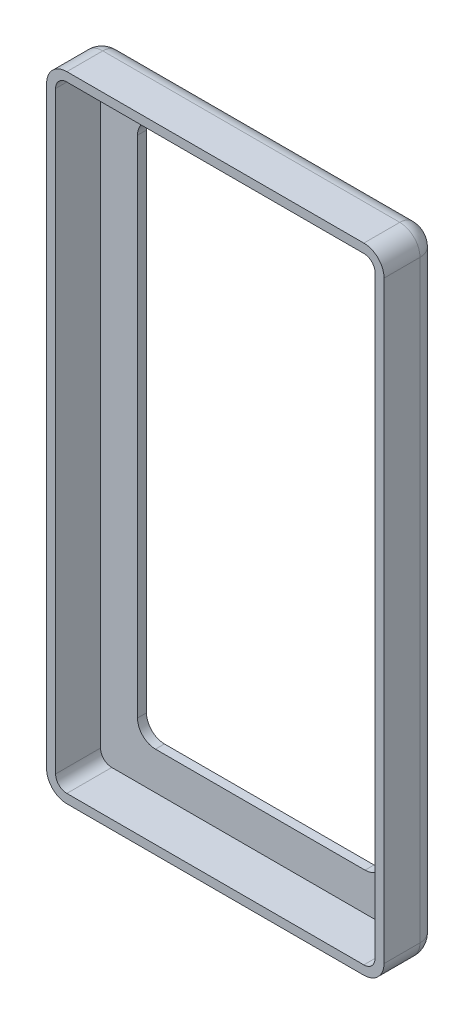
ISO-10303-21;
HEADER;
FILE_DESCRIPTION(('STEP AP214'),'2;1');
FILE_NAME('part.step','',(''),(''),'','','');
FILE_SCHEMA(('AUTOMOTIVE_DESIGN { 1 0 10303 214 1 1 1 1 }'));
ENDSEC;
DATA;
#1=APPLICATION_CONTEXT('core data for automotive mechanical design processes');
#2=APPLICATION_PROTOCOL_DEFINITION('international standard','automotive_design',2000,#1);
#3=PRODUCT_CONTEXT('',#1,'mechanical');
#4=PRODUCT('Part','Part','',(#3));
#5=PRODUCT_RELATED_PRODUCT_CATEGORY('part','',(#4));
#6=PRODUCT_DEFINITION_FORMATION('','',#4);
#7=PRODUCT_DEFINITION_CONTEXT('part definition',#1,'design');
#8=PRODUCT_DEFINITION('design','',#6,#7);
#9=PRODUCT_DEFINITION_SHAPE('','',#8);
#10=(LENGTH_UNIT() NAMED_UNIT(*) SI_UNIT(.MILLI.,.METRE.));
#11=(NAMED_UNIT(*) PLANE_ANGLE_UNIT() SI_UNIT($,.RADIAN.));
#12=(NAMED_UNIT(*) SI_UNIT($,.STERADIAN.) SOLID_ANGLE_UNIT());
#13=UNCERTAINTY_MEASURE_WITH_UNIT(LENGTH_MEASURE(1.E-05),#10,'distance_accuracy_value','');
#14=(GEOMETRIC_REPRESENTATION_CONTEXT(3) GLOBAL_UNCERTAINTY_ASSIGNED_CONTEXT((#13)) GLOBAL_UNIT_ASSIGNED_CONTEXT((#10,
#11,#12)) REPRESENTATION_CONTEXT('',''));
#15=CARTESIAN_POINT('',(0.,0.,0.));
#16=DIRECTION('',(0.,0.,1.));
#17=DIRECTION('',(1.,0.,0.));
#18=AXIS2_PLACEMENT_3D('',#15,#16,#17);
#19=CARTESIAN_POINT('',(32.5737767757912,-65.098576794141,10.));
#20=DIRECTION('',(0.,0.,-1.));
#21=DIRECTION('',(-1.,0.,0.));
#22=AXIS2_PLACEMENT_3D('',#19,#20,#21);
#23=CYLINDRICAL_SURFACE('',#22,4.5);
#24=DIRECTION('',(0.,0.,-1.));
#25=VECTOR('',#24,1.);
#26=CARTESIAN_POINT('',(32.5737767757912,-69.598576794141,10.));
#27=LINE('',#26,#25);
#28=CARTESIAN_POINT('',(32.5737767757912,-69.598576794141,10.));
#29=VERTEX_POINT('',#28);
#30=CARTESIAN_POINT('',(32.5737767757912,-69.598576794141,2.));
#31=VERTEX_POINT('',#30);
#32=EDGE_CURVE('E333',#29,#31,#27,.T.);
#33=ORIENTED_EDGE('',*,*,#32,.T.);
#34=CARTESIAN_POINT('',(32.5737767757912,-65.098576794141,2.));
#35=DIRECTION('',(0.,0.,1.));
#36=DIRECTION('',(1.,0.,0.));
#37=AXIS2_PLACEMENT_3D('',#34,#35,#36);
#38=CIRCLE('',#37,4.5);
#39=CARTESIAN_POINT('',(37.0737767757912,-65.098576794141,2.));
#40=VERTEX_POINT('',#39);
#41=EDGE_CURVE('E388',#31,#40,#38,.T.);
#42=ORIENTED_EDGE('',*,*,#41,.T.);
#43=DIRECTION('',(0.,0.,1.));
#44=VECTOR('',#43,1.);
#45=CARTESIAN_POINT('',(37.0737767757912,-65.098576794141,10.));
#46=LINE('',#45,#44);
#47=CARTESIAN_POINT('',(37.0737767757912,-65.098576794141,10.));
#48=VERTEX_POINT('',#47);
#49=EDGE_CURVE('E328',#48,#40,#46,.F.);
#50=ORIENTED_EDGE('',*,*,#49,.F.);
#51=CARTESIAN_POINT('',(32.5737767757912,-65.098576794141,10.));
#52=DIRECTION('',(0.,0.,1.));
#53=DIRECTION('',(1.,0.,0.));
#54=AXIS2_PLACEMENT_3D('',#51,#52,#53);
#55=CIRCLE('',#54,4.5);
#56=EDGE_CURVE('E327',#29,#48,#55,.T.);
#57=ORIENTED_EDGE('',*,*,#56,.F.);
#58=EDGE_LOOP('',(#33,#42,#50,#57));
#59=FACE_BOUND('',#58,.T.);
#60=ADVANCED_FACE('F34',(#59),#23,.T.);
#61=CARTESIAN_POINT('',(37.0737767757912,-65.098576794141,10.));
#62=DIRECTION('',(-1.,0.,0.));
#63=DIRECTION('',(0.,0.,1.));
#64=AXIS2_PLACEMENT_3D('',#61,#62,#63);
#65=PLANE('',#64);
#66=ORIENTED_EDGE('',*,*,#49,.T.);
#67=DIRECTION('',(0.,1.,0.));
#68=VECTOR('',#67,1.);
#69=CARTESIAN_POINT('',(37.0737767757912,-65.098576794141,2.));
#70=LINE('',#69,#68);
#71=CARTESIAN_POINT('',(37.0737767757912,67.061423205859,2.));
#72=VERTEX_POINT('',#71);
#73=EDGE_CURVE('E331',#40,#72,#70,.T.);
#74=ORIENTED_EDGE('',*,*,#73,.T.);
#75=DIRECTION('',(0.,0.,-1.));
#76=VECTOR('',#75,1.);
#77=CARTESIAN_POINT('',(37.0737767757912,67.061423205859,10.));
#78=LINE('',#77,#76);
#79=CARTESIAN_POINT('',(37.0737767757912,67.061423205859,10.));
#80=VERTEX_POINT('',#79);
#81=EDGE_CURVE('E332',#80,#72,#78,.T.);
#82=ORIENTED_EDGE('',*,*,#81,.F.);
#83=DIRECTION('',(0.,1.,0.));
#84=VECTOR('',#83,1.);
#85=CARTESIAN_POINT('',(37.0737767757912,-65.098576794141,10.));
#86=LINE('',#85,#84);
#87=EDGE_CURVE('E356',#48,#80,#86,.T.);
#88=ORIENTED_EDGE('',*,*,#87,.F.);
#89=EDGE_LOOP('',(#66,#74,#82,#88));
#90=FACE_BOUND('',#89,.T.);
#91=ADVANCED_FACE('F474',(#90),#65,.F.);
#92=CARTESIAN_POINT('',(32.5737767757912,67.061423205859,10.));
#93=DIRECTION('',(0.,0.,-1.));
#94=DIRECTION('',(-1.,0.,0.));
#95=AXIS2_PLACEMENT_3D('',#92,#93,#94);
#96=CYLINDRICAL_SURFACE('',#95,4.5);
#97=ORIENTED_EDGE('',*,*,#81,.T.);
#98=CARTESIAN_POINT('',(32.5737767757912,67.061423205859,2.));
#99=DIRECTION('',(0.,0.,1.));
#100=DIRECTION('',(1.,0.,0.));
#101=AXIS2_PLACEMENT_3D('',#98,#99,#100);
#102=CIRCLE('',#101,4.5);
#103=CARTESIAN_POINT('',(32.5737767757912,71.561423205859,2.));
#104=VERTEX_POINT('',#103);
#105=EDGE_CURVE('E400',#72,#104,#102,.T.);
#106=ORIENTED_EDGE('',*,*,#105,.T.);
#107=DIRECTION('',(0.,0.,-1.));
#108=VECTOR('',#107,1.);
#109=CARTESIAN_POINT('',(32.5737767757912,71.561423205859,10.));
#110=LINE('',#109,#108);
#111=CARTESIAN_POINT('',(32.5737767757912,71.561423205859,10.));
#112=VERTEX_POINT('',#111);
#113=EDGE_CURVE('E340',#112,#104,#110,.T.);
#114=ORIENTED_EDGE('',*,*,#113,.F.);
#115=CARTESIAN_POINT('',(32.5737767757912,67.061423205859,10.));
#116=DIRECTION('',(0.,0.,1.));
#117=DIRECTION('',(1.,0.,0.));
#118=AXIS2_PLACEMENT_3D('',#115,#116,#117);
#119=CIRCLE('',#118,4.5);
#120=EDGE_CURVE('E358',#80,#112,#119,.T.);
#121=ORIENTED_EDGE('',*,*,#120,.F.);
#122=EDGE_LOOP('',(#97,#106,#114,#121));
#123=FACE_BOUND('',#122,.T.);
#124=ADVANCED_FACE('F480',(#123),#96,.T.);
#125=CARTESIAN_POINT('',(-33.5462232242087,71.561423205859,10.));
#126=DIRECTION('',(0.,-1.,0.));
#127=DIRECTION('',(0.,0.,-1.));
#128=AXIS2_PLACEMENT_3D('',#125,#126,#127);
#129=PLANE('',#128);
#130=ORIENTED_EDGE('',*,*,#113,.T.);
#131=DIRECTION('',(-1.,0.,0.));
#132=VECTOR('',#131,1.);
#133=CARTESIAN_POINT('',(-33.5462232242087,71.561423205859,2.));
#134=LINE('',#133,#132);
#135=CARTESIAN_POINT('',(-33.5462232242087,71.561423205859,2.));
#136=VERTEX_POINT('',#135);
#137=EDGE_CURVE('E398',#104,#136,#134,.T.);
#138=ORIENTED_EDGE('',*,*,#137,.T.);
#139=DIRECTION('',(0.,0.,-1.));
#140=VECTOR('',#139,1.);
#141=CARTESIAN_POINT('',(-33.5462232242087,71.561423205859,10.));
#142=LINE('',#141,#140);
#143=CARTESIAN_POINT('',(-33.5462232242087,71.561423205859,10.));
#144=VERTEX_POINT('',#143);
#145=EDGE_CURVE('E343',#144,#136,#142,.T.);
#146=ORIENTED_EDGE('',*,*,#145,.F.);
#147=DIRECTION('',(-1.,0.,0.));
#148=VECTOR('',#147,1.);
#149=CARTESIAN_POINT('',(-33.5462232242087,71.561423205859,10.));
#150=LINE('',#149,#148);
#151=EDGE_CURVE('E360',#112,#144,#150,.T.);
#152=ORIENTED_EDGE('',*,*,#151,.F.);
#153=EDGE_LOOP('',(#130,#138,#146,#152));
#154=FACE_BOUND('',#153,.T.);
#155=ADVANCED_FACE('F489',(#154),#129,.F.);
#156=CARTESIAN_POINT('',(-33.5462232242088,67.061423205859,10.));
#157=DIRECTION('',(0.,0.,-1.));
#158=DIRECTION('',(-1.,0.,0.));
#159=AXIS2_PLACEMENT_3D('',#156,#157,#158);
#160=CYLINDRICAL_SURFACE('',#159,4.5);
#161=ORIENTED_EDGE('',*,*,#145,.T.);
#162=CARTESIAN_POINT('',(-33.5462232242088,67.061423205859,2.));
#163=DIRECTION('',(0.,0.,1.));
#164=DIRECTION('',(1.,0.,0.));
#165=AXIS2_PLACEMENT_3D('',#162,#163,#164);
#166=CIRCLE('',#165,4.5);
#167=CARTESIAN_POINT('',(-38.0462232242088,67.061423205859,2.));
#168=VERTEX_POINT('',#167);
#169=EDGE_CURVE('E396',#136,#168,#166,.T.);
#170=ORIENTED_EDGE('',*,*,#169,.T.);
#171=DIRECTION('',(0.,0.,-1.));
#172=VECTOR('',#171,1.);
#173=CARTESIAN_POINT('',(-38.0462232242088,67.061423205859,10.));
#174=LINE('',#173,#172);
#175=CARTESIAN_POINT('',(-38.0462232242088,67.061423205859,10.));
#176=VERTEX_POINT('',#175);
#177=EDGE_CURVE('E346',#176,#168,#174,.T.);
#178=ORIENTED_EDGE('',*,*,#177,.F.);
#179=CARTESIAN_POINT('',(-33.5462232242088,67.061423205859,10.));
#180=DIRECTION('',(0.,0.,1.));
#181=DIRECTION('',(1.,0.,0.));
#182=AXIS2_PLACEMENT_3D('',#179,#180,#181);
#183=CIRCLE('',#182,4.5);
#184=EDGE_CURVE('E362',#144,#176,#183,.T.);
#185=ORIENTED_EDGE('',*,*,#184,.F.);
#186=EDGE_LOOP('',(#161,#170,#178,#185));
#187=FACE_BOUND('',#186,.T.);
#188=ADVANCED_FACE('F493',(#187),#160,.T.);
#189=CARTESIAN_POINT('',(-38.0462232242088,-65.098576794141,10.));
#190=DIRECTION('',(1.,0.,0.));
#191=DIRECTION('',(0.,0.,-1.));
#192=AXIS2_PLACEMENT_3D('',#189,#190,#191);
#193=PLANE('',#192);
#194=ORIENTED_EDGE('',*,*,#177,.T.);
#195=DIRECTION('',(0.,-1.,0.));
#196=VECTOR('',#195,1.);
#197=CARTESIAN_POINT('',(-38.0462232242088,-65.098576794141,2.));
#198=LINE('',#197,#196);
#199=CARTESIAN_POINT('',(-38.0462232242088,-65.098576794141,2.));
#200=VERTEX_POINT('',#199);
#201=EDGE_CURVE('E394',#168,#200,#198,.T.);
#202=ORIENTED_EDGE('',*,*,#201,.T.);
#203=DIRECTION('',(0.,0.,-1.));
#204=VECTOR('',#203,1.);
#205=CARTESIAN_POINT('',(-38.0462232242088,-65.098576794141,10.));
#206=LINE('',#205,#204);
#207=CARTESIAN_POINT('',(-38.0462232242088,-65.098576794141,10.));
#208=VERTEX_POINT('',#207);
#209=EDGE_CURVE('E349',#208,#200,#206,.T.);
#210=ORIENTED_EDGE('',*,*,#209,.F.);
#211=DIRECTION('',(0.,-1.,0.));
#212=VECTOR('',#211,1.);
#213=CARTESIAN_POINT('',(-38.0462232242088,-65.098576794141,10.));
#214=LINE('',#213,#212);
#215=EDGE_CURVE('E364',#176,#208,#214,.T.);
#216=ORIENTED_EDGE('',*,*,#215,.F.);
#217=EDGE_LOOP('',(#194,#202,#210,#216));
#218=FACE_BOUND('',#217,.T.);
#219=ADVANCED_FACE('F497',(#218),#193,.F.);
#220=CARTESIAN_POINT('',(-33.5462232242088,-65.098576794141,10.));
#221=DIRECTION('',(0.,0.,-1.));
#222=DIRECTION('',(-1.,0.,0.));
#223=AXIS2_PLACEMENT_3D('',#220,#221,#222);
#224=CYLINDRICAL_SURFACE('',#223,4.5);
#225=ORIENTED_EDGE('',*,*,#209,.T.);
#226=CARTESIAN_POINT('',(-33.5462232242088,-65.098576794141,2.));
#227=DIRECTION('',(0.,0.,1.));
#228=DIRECTION('',(1.,0.,0.));
#229=AXIS2_PLACEMENT_3D('',#226,#227,#228);
#230=CIRCLE('',#229,4.5);
#231=CARTESIAN_POINT('',(-33.5462232242087,-69.598576794141,2.));
#232=VERTEX_POINT('',#231);
#233=EDGE_CURVE('E392',#200,#232,#230,.T.);
#234=ORIENTED_EDGE('',*,*,#233,.T.);
#235=DIRECTION('',(0.,0.,1.));
#236=VECTOR('',#235,1.);
#237=CARTESIAN_POINT('',(-33.5462232242087,-69.598576794141,10.));
#238=LINE('',#237,#236);
#239=CARTESIAN_POINT('',(-33.5462232242087,-69.598576794141,10.));
#240=VERTEX_POINT('',#239);
#241=EDGE_CURVE('E336',#240,#232,#238,.F.);
#242=ORIENTED_EDGE('',*,*,#241,.F.);
#243=CARTESIAN_POINT('',(-33.5462232242088,-65.098576794141,10.));
#244=DIRECTION('',(0.,0.,1.));
#245=DIRECTION('',(1.,0.,0.));
#246=AXIS2_PLACEMENT_3D('',#243,#244,#245);
#247=CIRCLE('',#246,4.5);
#248=EDGE_CURVE('E366',#208,#240,#247,.T.);
#249=ORIENTED_EDGE('',*,*,#248,.F.);
#250=EDGE_LOOP('',(#225,#234,#242,#249));
#251=FACE_BOUND('',#250,.T.);
#252=ADVANCED_FACE('F501',(#251),#224,.T.);
#253=CARTESIAN_POINT('',(-33.5462232242087,-69.598576794141,10.));
#254=DIRECTION('',(0.,1.,0.));
#255=DIRECTION('',(0.,0.,1.));
#256=AXIS2_PLACEMENT_3D('',#253,#254,#255);
#257=PLANE('',#256);
#258=ORIENTED_EDGE('',*,*,#241,.T.);
#259=DIRECTION('',(1.,0.,0.));
#260=VECTOR('',#259,1.);
#261=CARTESIAN_POINT('',(-33.5462232242087,-69.598576794141,2.));
#262=LINE('',#261,#260);
#263=EDGE_CURVE('E390',#232,#31,#262,.T.);
#264=ORIENTED_EDGE('',*,*,#263,.T.);
#265=ORIENTED_EDGE('',*,*,#32,.F.);
#266=DIRECTION('',(1.,0.,0.));
#267=VECTOR('',#266,1.);
#268=CARTESIAN_POINT('',(-33.5462232242087,-69.598576794141,10.));
#269=LINE('',#268,#267);
#270=EDGE_CURVE('E337',#240,#29,#269,.T.);
#271=ORIENTED_EDGE('',*,*,#270,.F.);
#272=EDGE_LOOP('',(#258,#264,#265,#271));
#273=FACE_BOUND('',#272,.T.);
#274=ADVANCED_FACE('F505',(#273),#257,.F.);
#275=CARTESIAN_POINT('',(32.5737767757912,-65.098576794141,10.));
#276=DIRECTION('',(0.,0.,1.));
#277=DIRECTION('',(1.,0.,0.));
#278=AXIS2_PLACEMENT_3D('',#275,#276,#277);
#279=PLANE('',#278);
#280=CARTESIAN_POINT('',(32.5737767757912,-65.098576794141,10.));
#281=DIRECTION('',(0.,0.,1.));
#282=DIRECTION('',(1.,0.,0.));
#283=AXIS2_PLACEMENT_3D('',#280,#281,#282);
#284=CIRCLE('',#283,2.5);
#285=CARTESIAN_POINT('',(32.5737767757912,-67.598576794141,10.));
#286=VERTEX_POINT('',#285);
#287=CARTESIAN_POINT('',(35.0737767757912,-65.098576794141,10.));
#288=VERTEX_POINT('',#287);
#289=EDGE_CURVE('E268',#286,#288,#284,.T.);
#290=ORIENTED_EDGE('',*,*,#289,.F.);
#291=DIRECTION('',(1.,0.,0.));
#292=VECTOR('',#291,1.);
#293=CARTESIAN_POINT('',(-33.5462232242087,-67.598576794141,10.));
#294=LINE('',#293,#292);
#295=CARTESIAN_POINT('',(-33.5462232242087,-67.598576794141,10.));
#296=VERTEX_POINT('',#295);
#297=EDGE_CURVE('E284',#296,#286,#294,.T.);
#298=ORIENTED_EDGE('',*,*,#297,.F.);
#299=CARTESIAN_POINT('',(-33.5462232242088,-65.098576794141,10.));
#300=DIRECTION('',(0.,0.,1.));
#301=DIRECTION('',(-1.,0.,0.));
#302=AXIS2_PLACEMENT_3D('',#299,#300,#301);
#303=CIRCLE('',#302,2.5);
#304=CARTESIAN_POINT('',(-36.0462232242088,-65.098576794141,10.));
#305=VERTEX_POINT('',#304);
#306=EDGE_CURVE('E281',#305,#296,#303,.T.);
#307=ORIENTED_EDGE('',*,*,#306,.F.);
#308=DIRECTION('',(0.,-1.,0.));
#309=VECTOR('',#308,1.);
#310=CARTESIAN_POINT('',(-36.0462232242088,-65.098576794141,10.));
#311=LINE('',#310,#309);
#312=CARTESIAN_POINT('',(-36.0462232242088,67.061423205859,10.));
#313=VERTEX_POINT('',#312);
#314=EDGE_CURVE('E279',#313,#305,#311,.T.);
#315=ORIENTED_EDGE('',*,*,#314,.F.);
#316=CARTESIAN_POINT('',(-33.5462232242088,67.061423205859,10.));
#317=DIRECTION('',(0.,0.,1.));
#318=DIRECTION('',(-1.,0.,0.));
#319=AXIS2_PLACEMENT_3D('',#316,#317,#318);
#320=CIRCLE('',#319,2.5);
#321=CARTESIAN_POINT('',(-33.5462232242087,69.561423205859,10.));
#322=VERTEX_POINT('',#321);
#323=EDGE_CURVE('E277',#322,#313,#320,.T.);
#324=ORIENTED_EDGE('',*,*,#323,.F.);
#325=DIRECTION('',(-1.,0.,0.));
#326=VECTOR('',#325,1.);
#327=CARTESIAN_POINT('',(-33.5462232242087,69.561423205859,10.));
#328=LINE('',#327,#326);
#329=CARTESIAN_POINT('',(32.5737767757912,69.561423205859,10.));
#330=VERTEX_POINT('',#329);
#331=EDGE_CURVE('E275',#330,#322,#328,.T.);
#332=ORIENTED_EDGE('',*,*,#331,.F.);
#333=CARTESIAN_POINT('',(32.5737767757912,67.061423205859,10.));
#334=DIRECTION('',(0.,0.,1.));
#335=DIRECTION('',(-1.,0.,0.));
#336=AXIS2_PLACEMENT_3D('',#333,#334,#335);
#337=CIRCLE('',#336,2.5);
#338=CARTESIAN_POINT('',(35.0737767757912,67.061423205859,10.));
#339=VERTEX_POINT('',#338);
#340=EDGE_CURVE('E273',#339,#330,#337,.T.);
#341=ORIENTED_EDGE('',*,*,#340,.F.);
#342=DIRECTION('',(0.,1.,0.));
#343=VECTOR('',#342,1.);
#344=CARTESIAN_POINT('',(35.0737767757912,-65.098576794141,10.));
#345=LINE('',#344,#343);
#346=EDGE_CURVE('E270',#288,#339,#345,.T.);
#347=ORIENTED_EDGE('',*,*,#346,.F.);
#348=EDGE_LOOP('',(#290,#298,#307,#315,#324,#332,#341,#347));
#349=FACE_BOUND('',#348,.T.);
#350=ORIENTED_EDGE('',*,*,#56,.T.);
#351=ORIENTED_EDGE('',*,*,#87,.T.);
#352=ORIENTED_EDGE('',*,*,#120,.T.);
#353=ORIENTED_EDGE('',*,*,#151,.T.);
#354=ORIENTED_EDGE('',*,*,#184,.T.);
#355=ORIENTED_EDGE('',*,*,#215,.T.);
#356=ORIENTED_EDGE('',*,*,#248,.T.);
#357=ORIENTED_EDGE('',*,*,#270,.T.);
#358=EDGE_LOOP('',(#350,#351,#352,#353,#354,#355,#356,#357));
#359=FACE_BOUND('',#358,.T.);
#360=ADVANCED_FACE('F484',(#349,#359),#279,.T.);
#361=CARTESIAN_POINT('',(32.5737767757912,-65.098576794141,-2.));
#362=DIRECTION('',(0.,0.,1.));
#363=DIRECTION('',(1.,0.,0.));
#364=AXIS2_PLACEMENT_3D('',#361,#362,#363);
#365=PLANE('',#364);
#366=DIRECTION('',(0.,1.,0.));
#367=VECTOR('',#366,1.);
#368=CARTESIAN_POINT('',(-27.8139770801232,-55.1970568673888,-2.));
#369=LINE('',#368,#367);
#370=CARTESIAN_POINT('',(-27.8139770801232,-55.1970568673888,-2.));
#371=VERTEX_POINT('',#370);
#372=CARTESIAN_POINT('',(-27.8139770801232,57.1599032791067,-2.));
#373=VERTEX_POINT('',#372);
#374=EDGE_CURVE('E230',#371,#373,#369,.T.);
#375=ORIENTED_EDGE('',*,*,#374,.F.);
#376=CARTESIAN_POINT('',(-23.8139770801232,-55.1970568673889,-2.));
#377=DIRECTION('',(0.,0.,-1.));
#378=DIRECTION('',(-1.,0.,0.));
#379=AXIS2_PLACEMENT_3D('',#376,#377,#378);
#380=CIRCLE('',#379,4.);
#381=CARTESIAN_POINT('',(-23.8139770801232,-59.1970568673888,-2.));
#382=VERTEX_POINT('',#381);
#383=EDGE_CURVE('E49',#382,#371,#380,.T.);
#384=ORIENTED_EDGE('',*,*,#383,.F.);
#385=DIRECTION('',(-1.,0.,0.));
#386=VECTOR('',#385,1.);
#387=CARTESIAN_POINT('',(22.8415306317057,-59.1970568673888,-2.));
#388=LINE('',#387,#386);
#389=CARTESIAN_POINT('',(22.8415306317057,-59.1970568673888,-2.));
#390=VERTEX_POINT('',#389);
#391=EDGE_CURVE('E252',#390,#382,#388,.T.);
#392=ORIENTED_EDGE('',*,*,#391,.F.);
#393=CARTESIAN_POINT('',(22.8415306317057,-55.1970568673889,-2.));
#394=DIRECTION('',(0.,0.,-1.));
#395=DIRECTION('',(1.,0.,0.));
#396=AXIS2_PLACEMENT_3D('',#393,#394,#395);
#397=CIRCLE('',#396,4.);
#398=CARTESIAN_POINT('',(26.8415306317057,-55.1970568673889,-2.));
#399=VERTEX_POINT('',#398);
#400=EDGE_CURVE('E249',#399,#390,#397,.T.);
#401=ORIENTED_EDGE('',*,*,#400,.F.);
#402=DIRECTION('',(0.,-1.,0.));
#403=VECTOR('',#402,1.);
#404=CARTESIAN_POINT('',(26.8415306317057,-55.1970568673888,-2.));
#405=LINE('',#404,#403);
#406=CARTESIAN_POINT('',(26.8415306317057,57.1599032791067,-2.));
#407=VERTEX_POINT('',#406);
#408=EDGE_CURVE('E246',#407,#399,#405,.T.);
#409=ORIENTED_EDGE('',*,*,#408,.F.);
#410=CARTESIAN_POINT('',(22.8415306317057,57.1599032791068,-2.));
#411=DIRECTION('',(0.,0.,-1.));
#412=DIRECTION('',(1.,0.,0.));
#413=AXIS2_PLACEMENT_3D('',#410,#411,#412);
#414=CIRCLE('',#413,4.);
#415=CARTESIAN_POINT('',(22.8415306317057,61.1599032791068,-2.));
#416=VERTEX_POINT('',#415);
#417=EDGE_CURVE('E240',#416,#407,#414,.T.);
#418=ORIENTED_EDGE('',*,*,#417,.F.);
#419=DIRECTION('',(1.,0.,0.));
#420=VECTOR('',#419,1.);
#421=CARTESIAN_POINT('',(22.8415306317057,61.1599032791068,-2.));
#422=LINE('',#421,#420);
#423=CARTESIAN_POINT('',(-23.8139770801232,61.1599032791068,-2.));
#424=VERTEX_POINT('',#423);
#425=EDGE_CURVE('E238',#424,#416,#422,.T.);
#426=ORIENTED_EDGE('',*,*,#425,.F.);
#427=CARTESIAN_POINT('',(-23.8139770801232,57.1599032791068,-2.));
#428=DIRECTION('',(0.,0.,-1.));
#429=DIRECTION('',(1.,0.,0.));
#430=AXIS2_PLACEMENT_3D('',#427,#428,#429);
#431=CIRCLE('',#430,4.);
#432=EDGE_CURVE('E221',#373,#424,#431,.T.);
#433=ORIENTED_EDGE('',*,*,#432,.F.);
#434=EDGE_LOOP('',(#375,#384,#392,#401,#409,#418,#426,#433));
#435=FACE_BOUND('',#434,.T.);
#436=CARTESIAN_POINT('',(32.5737767757912,67.061423205859,-2.));
#437=DIRECTION('',(0.,0.,1.));
#438=DIRECTION('',(1.,0.,0.));
#439=AXIS2_PLACEMENT_3D('',#436,#437,#438);
#440=CIRCLE('',#439,0.500000000000002);
#441=CARTESIAN_POINT('',(32.5737767757912,67.561423205859,-2.));
#442=VERTEX_POINT('',#441);
#443=CARTESIAN_POINT('',(33.0737767757912,67.061423205859,-2.));
#444=VERTEX_POINT('',#443);
#445=EDGE_CURVE('E371',#442,#444,#440,.F.);
#446=ORIENTED_EDGE('',*,*,#445,.T.);
#447=DIRECTION('',(0.,1.,0.));
#448=VECTOR('',#447,1.);
#449=CARTESIAN_POINT('',(33.0737767757912,-65.098576794141,-2.));
#450=LINE('',#449,#448);
#451=CARTESIAN_POINT('',(33.0737767757912,-65.098576794141,-2.));
#452=VERTEX_POINT('',#451);
#453=EDGE_CURVE('E385',#444,#452,#450,.F.);
#454=ORIENTED_EDGE('',*,*,#453,.T.);
#455=CARTESIAN_POINT('',(32.5737767757912,-65.098576794141,-2.));
#456=DIRECTION('',(0.,0.,1.));
#457=DIRECTION('',(1.,0.,0.));
#458=AXIS2_PLACEMENT_3D('',#455,#456,#457);
#459=CIRCLE('',#458,0.500000000000002);
#460=CARTESIAN_POINT('',(32.5737767757912,-65.598576794141,-2.));
#461=VERTEX_POINT('',#460);
#462=EDGE_CURVE('E383',#452,#461,#459,.F.);
#463=ORIENTED_EDGE('',*,*,#462,.T.);
#464=DIRECTION('',(1.,0.,0.));
#465=VECTOR('',#464,1.);
#466=CARTESIAN_POINT('',(32.5737767757912,-65.598576794141,-2.));
#467=LINE('',#466,#465);
#468=CARTESIAN_POINT('',(-33.5462232242087,-65.598576794141,-2.));
#469=VERTEX_POINT('',#468);
#470=EDGE_CURVE('E381',#461,#469,#467,.F.);
#471=ORIENTED_EDGE('',*,*,#470,.T.);
#472=CARTESIAN_POINT('',(-33.5462232242088,-65.098576794141,-2.));
#473=DIRECTION('',(0.,0.,1.));
#474=DIRECTION('',(1.,0.,0.));
#475=AXIS2_PLACEMENT_3D('',#472,#473,#474);
#476=CIRCLE('',#475,0.500000000000002);
#477=CARTESIAN_POINT('',(-34.0462232242088,-65.098576794141,-2.));
#478=VERTEX_POINT('',#477);
#479=EDGE_CURVE('E379',#469,#478,#476,.F.);
#480=ORIENTED_EDGE('',*,*,#479,.T.);
#481=DIRECTION('',(0.,-1.,0.));
#482=VECTOR('',#481,1.);
#483=CARTESIAN_POINT('',(-34.0462232242088,-65.098576794141,-2.));
#484=LINE('',#483,#482);
#485=CARTESIAN_POINT('',(-34.0462232242088,67.061423205859,-2.));
#486=VERTEX_POINT('',#485);
#487=EDGE_CURVE('E377',#478,#486,#484,.F.);
#488=ORIENTED_EDGE('',*,*,#487,.T.);
#489=CARTESIAN_POINT('',(-33.5462232242088,67.061423205859,-2.));
#490=DIRECTION('',(0.,0.,1.));
#491=DIRECTION('',(1.,0.,0.));
#492=AXIS2_PLACEMENT_3D('',#489,#490,#491);
#493=CIRCLE('',#492,0.500000000000002);
#494=CARTESIAN_POINT('',(-33.5462232242088,67.561423205859,-2.));
#495=VERTEX_POINT('',#494);
#496=EDGE_CURVE('E375',#486,#495,#493,.F.);
#497=ORIENTED_EDGE('',*,*,#496,.T.);
#498=DIRECTION('',(-1.,0.,0.));
#499=VECTOR('',#498,1.);
#500=CARTESIAN_POINT('',(32.5737767757912,67.561423205859,-2.));
#501=LINE('',#500,#499);
#502=EDGE_CURVE('E373',#495,#442,#501,.F.);
#503=ORIENTED_EDGE('',*,*,#502,.T.);
#504=EDGE_LOOP('',(#446,#454,#463,#471,#480,#488,#497,#503));
#505=FACE_BOUND('',#504,.T.);
#506=ADVANCED_FACE('F234',(#435,#505),#365,.F.);
#507=CARTESIAN_POINT('',(32.5737767757912,-65.098576794141,10.));
#508=DIRECTION('',(0.,0.,-1.));
#509=DIRECTION('',(-1.,0.,0.));
#510=AXIS2_PLACEMENT_3D('',#507,#508,#509);
#511=CYLINDRICAL_SURFACE('',#510,2.5);
#512=CARTESIAN_POINT('',(32.5737767757912,-65.098576794141,0.));
#513=DIRECTION('',(0.,0.,1.));
#514=DIRECTION('',(1.,0.,0.));
#515=AXIS2_PLACEMENT_3D('',#512,#513,#514);
#516=CIRCLE('',#515,2.5);
#517=CARTESIAN_POINT('',(32.5737767757912,-67.598576794141,0.));
#518=VERTEX_POINT('',#517);
#519=CARTESIAN_POINT('',(35.0737767757912,-65.098576794141,0.));
#520=VERTEX_POINT('',#519);
#521=EDGE_CURVE('E287',#518,#520,#516,.T.);
#522=ORIENTED_EDGE('',*,*,#521,.F.);
#523=DIRECTION('',(0.,0.,-1.));
#524=VECTOR('',#523,1.);
#525=CARTESIAN_POINT('',(32.5737767757912,-67.598576794141,10.));
#526=LINE('',#525,#524);
#527=EDGE_CURVE('E286',#286,#518,#526,.T.);
#528=ORIENTED_EDGE('',*,*,#527,.F.);
#529=ORIENTED_EDGE('',*,*,#289,.T.);
#530=DIRECTION('',(0.,0.,-1.));
#531=VECTOR('',#530,1.);
#532=CARTESIAN_POINT('',(35.0737767757912,-65.098576794141,10.));
#533=LINE('',#532,#531);
#534=EDGE_CURVE('E324',#288,#520,#533,.T.);
#535=ORIENTED_EDGE('',*,*,#534,.T.);
#536=EDGE_LOOP('',(#522,#528,#529,#535));
#537=FACE_BOUND('',#536,.T.);
#538=ADVANCED_FACE('F511',(#537),#511,.F.);
#539=CARTESIAN_POINT('',(35.0737767757912,-65.098576794141,10.));
#540=DIRECTION('',(-1.,0.,0.));
#541=DIRECTION('',(0.,0.,1.));
#542=AXIS2_PLACEMENT_3D('',#539,#540,#541);
#543=PLANE('',#542);
#544=DIRECTION('',(0.,1.,0.));
#545=VECTOR('',#544,1.);
#546=CARTESIAN_POINT('',(35.0737767757912,-65.098576794141,0.));
#547=LINE('',#546,#545);
#548=CARTESIAN_POINT('',(35.0737767757912,67.061423205859,0.));
#549=VERTEX_POINT('',#548);
#550=EDGE_CURVE('E290',#520,#549,#547,.T.);
#551=ORIENTED_EDGE('',*,*,#550,.F.);
#552=ORIENTED_EDGE('',*,*,#534,.F.);
#553=ORIENTED_EDGE('',*,*,#346,.T.);
#554=DIRECTION('',(0.,0.,-1.));
#555=VECTOR('',#554,1.);
#556=CARTESIAN_POINT('',(35.0737767757912,67.061423205859,10.));
#557=LINE('',#556,#555);
#558=EDGE_CURVE('E321',#339,#549,#557,.T.);
#559=ORIENTED_EDGE('',*,*,#558,.T.);
#560=EDGE_LOOP('',(#551,#552,#553,#559));
#561=FACE_BOUND('',#560,.T.);
#562=ADVANCED_FACE('F592',(#561),#543,.T.);
#563=CARTESIAN_POINT('',(32.5737767757912,67.061423205859,10.));
#564=DIRECTION('',(0.,0.,-1.));
#565=DIRECTION('',(-1.,0.,0.));
#566=AXIS2_PLACEMENT_3D('',#563,#564,#565);
#567=CYLINDRICAL_SURFACE('',#566,2.5);
#568=CARTESIAN_POINT('',(32.5737767757912,67.061423205859,0.));
#569=DIRECTION('',(0.,0.,1.));
#570=DIRECTION('',(-1.,0.,0.));
#571=AXIS2_PLACEMENT_3D('',#568,#569,#570);
#572=CIRCLE('',#571,2.5);
#573=CARTESIAN_POINT('',(32.5737767757912,69.561423205859,0.));
#574=VERTEX_POINT('',#573);
#575=EDGE_CURVE('E293',#549,#574,#572,.T.);
#576=ORIENTED_EDGE('',*,*,#575,.F.);
#577=ORIENTED_EDGE('',*,*,#558,.F.);
#578=ORIENTED_EDGE('',*,*,#340,.T.);
#579=DIRECTION('',(0.,0.,-1.));
#580=VECTOR('',#579,1.);
#581=CARTESIAN_POINT('',(32.5737767757912,69.561423205859,10.));
#582=LINE('',#581,#580);
#583=EDGE_CURVE('E318',#330,#574,#582,.T.);
#584=ORIENTED_EDGE('',*,*,#583,.T.);
#585=EDGE_LOOP('',(#576,#577,#578,#584));
#586=FACE_BOUND('',#585,.T.);
#587=ADVANCED_FACE('F618',(#586),#567,.F.);
#588=CARTESIAN_POINT('',(-33.5462232242087,69.561423205859,10.));
#589=DIRECTION('',(0.,-1.,0.));
#590=DIRECTION('',(0.,0.,-1.));
#591=AXIS2_PLACEMENT_3D('',#588,#589,#590);
#592=PLANE('',#591);
#593=DIRECTION('',(-1.,0.,0.));
#594=VECTOR('',#593,1.);
#595=CARTESIAN_POINT('',(-33.5462232242087,69.561423205859,0.));
#596=LINE('',#595,#594);
#597=CARTESIAN_POINT('',(-33.5462232242087,69.561423205859,0.));
#598=VERTEX_POINT('',#597);
#599=EDGE_CURVE('E295',#574,#598,#596,.T.);
#600=ORIENTED_EDGE('',*,*,#599,.F.);
#601=ORIENTED_EDGE('',*,*,#583,.F.);
#602=ORIENTED_EDGE('',*,*,#331,.T.);
#603=DIRECTION('',(0.,0.,-1.));
#604=VECTOR('',#603,1.);
#605=CARTESIAN_POINT('',(-33.5462232242087,69.561423205859,10.));
#606=LINE('',#605,#604);
#607=EDGE_CURVE('E315',#322,#598,#606,.T.);
#608=ORIENTED_EDGE('',*,*,#607,.T.);
#609=EDGE_LOOP('',(#600,#601,#602,#608));
#610=FACE_BOUND('',#609,.T.);
#611=ADVANCED_FACE('F615',(#610),#592,.T.);
#612=CARTESIAN_POINT('',(-33.5462232242088,67.061423205859,10.));
#613=DIRECTION('',(0.,0.,-1.));
#614=DIRECTION('',(-1.,0.,0.));
#615=AXIS2_PLACEMENT_3D('',#612,#613,#614);
#616=CYLINDRICAL_SURFACE('',#615,2.5);
#617=CARTESIAN_POINT('',(-33.5462232242088,67.061423205859,0.));
#618=DIRECTION('',(0.,0.,1.));
#619=DIRECTION('',(-1.,0.,0.));
#620=AXIS2_PLACEMENT_3D('',#617,#618,#619);
#621=CIRCLE('',#620,2.5);
#622=CARTESIAN_POINT('',(-36.0462232242088,67.061423205859,0.));
#623=VERTEX_POINT('',#622);
#624=EDGE_CURVE('E297',#598,#623,#621,.T.);
#625=ORIENTED_EDGE('',*,*,#624,.F.);
#626=ORIENTED_EDGE('',*,*,#607,.F.);
#627=ORIENTED_EDGE('',*,*,#323,.T.);
#628=DIRECTION('',(0.,0.,-1.));
#629=VECTOR('',#628,1.);
#630=CARTESIAN_POINT('',(-36.0462232242088,67.061423205859,10.));
#631=LINE('',#630,#629);
#632=EDGE_CURVE('E312',#313,#623,#631,.T.);
#633=ORIENTED_EDGE('',*,*,#632,.T.);
#634=EDGE_LOOP('',(#625,#626,#627,#633));
#635=FACE_BOUND('',#634,.T.);
#636=ADVANCED_FACE('F611',(#635),#616,.F.);
#637=CARTESIAN_POINT('',(-36.0462232242088,-65.098576794141,10.));
#638=DIRECTION('',(1.,0.,0.));
#639=DIRECTION('',(0.,0.,-1.));
#640=AXIS2_PLACEMENT_3D('',#637,#638,#639);
#641=PLANE('',#640);
#642=DIRECTION('',(0.,-1.,0.));
#643=VECTOR('',#642,1.);
#644=CARTESIAN_POINT('',(-36.0462232242088,-65.098576794141,0.));
#645=LINE('',#644,#643);
#646=CARTESIAN_POINT('',(-36.0462232242088,-65.098576794141,0.));
#647=VERTEX_POINT('',#646);
#648=EDGE_CURVE('E299',#623,#647,#645,.T.);
#649=ORIENTED_EDGE('',*,*,#648,.F.);
#650=ORIENTED_EDGE('',*,*,#632,.F.);
#651=ORIENTED_EDGE('',*,*,#314,.T.);
#652=DIRECTION('',(0.,0.,-1.));
#653=VECTOR('',#652,1.);
#654=CARTESIAN_POINT('',(-36.0462232242088,-65.098576794141,10.));
#655=LINE('',#654,#653);
#656=EDGE_CURVE('E309',#305,#647,#655,.T.);
#657=ORIENTED_EDGE('',*,*,#656,.T.);
#658=EDGE_LOOP('',(#649,#650,#651,#657));
#659=FACE_BOUND('',#658,.T.);
#660=ADVANCED_FACE('F608',(#659),#641,.T.);
#661=CARTESIAN_POINT('',(-33.5462232242088,-65.098576794141,10.));
#662=DIRECTION('',(0.,0.,-1.));
#663=DIRECTION('',(-1.,0.,0.));
#664=AXIS2_PLACEMENT_3D('',#661,#662,#663);
#665=CYLINDRICAL_SURFACE('',#664,2.5);
#666=CARTESIAN_POINT('',(-33.5462232242088,-65.098576794141,0.));
#667=DIRECTION('',(0.,0.,1.));
#668=DIRECTION('',(-1.,0.,0.));
#669=AXIS2_PLACEMENT_3D('',#666,#667,#668);
#670=CIRCLE('',#669,2.5);
#671=CARTESIAN_POINT('',(-33.5462232242087,-67.598576794141,0.));
#672=VERTEX_POINT('',#671);
#673=EDGE_CURVE('E301',#647,#672,#670,.T.);
#674=ORIENTED_EDGE('',*,*,#673,.F.);
#675=ORIENTED_EDGE('',*,*,#656,.F.);
#676=ORIENTED_EDGE('',*,*,#306,.T.);
#677=DIRECTION('',(0.,0.,-1.));
#678=VECTOR('',#677,1.);
#679=CARTESIAN_POINT('',(-33.5462232242087,-67.598576794141,10.));
#680=LINE('',#679,#678);
#681=EDGE_CURVE('E306',#296,#672,#680,.T.);
#682=ORIENTED_EDGE('',*,*,#681,.T.);
#683=EDGE_LOOP('',(#674,#675,#676,#682));
#684=FACE_BOUND('',#683,.T.);
#685=ADVANCED_FACE('F601',(#684),#665,.F.);
#686=CARTESIAN_POINT('',(-33.5462232242087,-67.598576794141,10.));
#687=DIRECTION('',(0.,1.,0.));
#688=DIRECTION('',(0.,0.,1.));
#689=AXIS2_PLACEMENT_3D('',#686,#687,#688);
#690=PLANE('',#689);
#691=DIRECTION('',(1.,0.,0.));
#692=VECTOR('',#691,1.);
#693=CARTESIAN_POINT('',(-33.5462232242087,-67.598576794141,0.));
#694=LINE('',#693,#692);
#695=EDGE_CURVE('E271',#672,#518,#694,.T.);
#696=ORIENTED_EDGE('',*,*,#695,.F.);
#697=ORIENTED_EDGE('',*,*,#681,.F.);
#698=ORIENTED_EDGE('',*,*,#297,.T.);
#699=ORIENTED_EDGE('',*,*,#527,.T.);
#700=EDGE_LOOP('',(#696,#697,#698,#699));
#701=FACE_BOUND('',#700,.T.);
#702=ADVANCED_FACE('F598',(#701),#690,.T.);
#703=CARTESIAN_POINT('',(32.5737767757912,-65.098576794141,0.));
#704=DIRECTION('',(0.,0.,1.));
#705=DIRECTION('',(1.,0.,0.));
#706=AXIS2_PLACEMENT_3D('',#703,#704,#705);
#707=PLANE('',#706);
#708=CARTESIAN_POINT('',(-23.8139770801232,-55.1970568673889,0.));
#709=DIRECTION('',(0.,0.,1.));
#710=DIRECTION('',(1.,0.,0.));
#711=AXIS2_PLACEMENT_3D('',#708,#709,#710);
#712=CIRCLE('',#711,4.);
#713=CARTESIAN_POINT('',(-27.8139770801232,-55.1970568673888,0.));
#714=VERTEX_POINT('',#713);
#715=CARTESIAN_POINT('',(-23.8139770801232,-59.1970568673888,0.));
#716=VERTEX_POINT('',#715);
#717=EDGE_CURVE('E11',#714,#716,#712,.T.);
#718=ORIENTED_EDGE('',*,*,#717,.F.);
#719=DIRECTION('',(0.,-1.,0.));
#720=VECTOR('',#719,1.);
#721=CARTESIAN_POINT('',(-27.8139770801232,-65.098576794141,0.));
#722=LINE('',#721,#720);
#723=CARTESIAN_POINT('',(-27.8139770801232,57.1599032791068,0.));
#724=VERTEX_POINT('',#723);
#725=EDGE_CURVE('E402',#724,#714,#722,.T.);
#726=ORIENTED_EDGE('',*,*,#725,.F.);
#727=CARTESIAN_POINT('',(-23.8139770801232,57.1599032791068,0.));
#728=DIRECTION('',(0.,0.,1.));
#729=DIRECTION('',(1.,0.,0.));
#730=AXIS2_PLACEMENT_3D('',#727,#728,#729);
#731=CIRCLE('',#730,4.);
#732=CARTESIAN_POINT('',(-23.8139770801232,61.1599032791068,0.));
#733=VERTEX_POINT('',#732);
#734=EDGE_CURVE('E224',#733,#724,#731,.T.);
#735=ORIENTED_EDGE('',*,*,#734,.F.);
#736=DIRECTION('',(-1.,0.,0.));
#737=VECTOR('',#736,1.);
#738=CARTESIAN_POINT('',(32.5737767757912,61.1599032791068,0.));
#739=LINE('',#738,#737);
#740=CARTESIAN_POINT('',(22.8415306317057,61.1599032791068,0.));
#741=VERTEX_POINT('',#740);
#742=EDGE_CURVE('E425',#741,#733,#739,.T.);
#743=ORIENTED_EDGE('',*,*,#742,.F.);
#744=CARTESIAN_POINT('',(22.8415306317057,57.1599032791068,0.));
#745=DIRECTION('',(0.,0.,1.));
#746=DIRECTION('',(1.,0.,0.));
#747=AXIS2_PLACEMENT_3D('',#744,#745,#746);
#748=CIRCLE('',#747,4.);
#749=CARTESIAN_POINT('',(26.8415306317057,57.1599032791067,0.));
#750=VERTEX_POINT('',#749);
#751=EDGE_CURVE('E427',#750,#741,#748,.T.);
#752=ORIENTED_EDGE('',*,*,#751,.F.);
#753=DIRECTION('',(0.,1.,0.));
#754=VECTOR('',#753,1.);
#755=CARTESIAN_POINT('',(26.8415306317057,-65.098576794141,0.));
#756=LINE('',#755,#754);
#757=CARTESIAN_POINT('',(26.8415306317057,-55.1970568673889,0.));
#758=VERTEX_POINT('',#757);
#759=EDGE_CURVE('E429',#758,#750,#756,.T.);
#760=ORIENTED_EDGE('',*,*,#759,.F.);
#761=CARTESIAN_POINT('',(22.8415306317057,-55.1970568673889,0.));
#762=DIRECTION('',(0.,0.,1.));
#763=DIRECTION('',(1.,0.,0.));
#764=AXIS2_PLACEMENT_3D('',#761,#762,#763);
#765=CIRCLE('',#764,4.);
#766=CARTESIAN_POINT('',(22.8415306317057,-59.1970568673888,0.));
#767=VERTEX_POINT('',#766);
#768=EDGE_CURVE('E431',#767,#758,#765,.T.);
#769=ORIENTED_EDGE('',*,*,#768,.F.);
#770=DIRECTION('',(1.,0.,0.));
#771=VECTOR('',#770,1.);
#772=CARTESIAN_POINT('',(32.5737767757912,-59.1970568673888,0.));
#773=LINE('',#772,#771);
#774=EDGE_CURVE('E42',#716,#767,#773,.T.);
#775=ORIENTED_EDGE('',*,*,#774,.F.);
#776=EDGE_LOOP('',(#718,#726,#735,#743,#752,#760,#769,#775));
#777=FACE_BOUND('',#776,.T.);
#778=ORIENTED_EDGE('',*,*,#521,.T.);
#779=ORIENTED_EDGE('',*,*,#550,.T.);
#780=ORIENTED_EDGE('',*,*,#575,.T.);
#781=ORIENTED_EDGE('',*,*,#599,.T.);
#782=ORIENTED_EDGE('',*,*,#624,.T.);
#783=ORIENTED_EDGE('',*,*,#648,.T.);
#784=ORIENTED_EDGE('',*,*,#673,.T.);
#785=ORIENTED_EDGE('',*,*,#695,.T.);
#786=EDGE_LOOP('',(#778,#779,#780,#781,#782,#783,#784,#785));
#787=FACE_BOUND('',#786,.T.);
#788=ADVANCED_FACE('F446',(#777,#787),#707,.T.);
#789=CARTESIAN_POINT('',(-34.0462232242088,-65.098576794141,2.));
#790=DIRECTION('',(0.,-1.,0.));
#791=DIRECTION('',(0.,0.,-1.));
#792=AXIS2_PLACEMENT_3D('',#789,#790,#791);
#793=CYLINDRICAL_SURFACE('',#792,4.);
#794=CARTESIAN_POINT('',(-34.0462232242088,67.061423205859,2.));
#795=DIRECTION('',(0.,1.,0.));
#796=DIRECTION('',(0.,0.,1.));
#797=AXIS2_PLACEMENT_3D('',#794,#795,#796);
#798=CIRCLE('',#797,4.);
#799=EDGE_CURVE('E418',#486,#168,#798,.T.);
#800=ORIENTED_EDGE('',*,*,#799,.F.);
#801=ORIENTED_EDGE('',*,*,#487,.F.);
#802=CARTESIAN_POINT('',(-34.0462232242088,-65.098576794141,2.));
#803=DIRECTION('',(0.,-1.,0.));
#804=DIRECTION('',(0.,0.,-1.));
#805=AXIS2_PLACEMENT_3D('',#802,#803,#804);
#806=CIRCLE('',#805,4.);
#807=EDGE_CURVE('E291',#200,#478,#806,.T.);
#808=ORIENTED_EDGE('',*,*,#807,.F.);
#809=ORIENTED_EDGE('',*,*,#201,.F.);
#810=EDGE_LOOP('',(#800,#801,#808,#809));
#811=FACE_BOUND('',#810,.T.);
#812=ADVANCED_FACE('F36',(#811),#793,.T.);
#813=CARTESIAN_POINT('',(-33.5462232242088,-65.098576794141,2.));
#814=DIRECTION('',(0.,0.,1.));
#815=DIRECTION('',(1.,0.,0.));
#816=AXIS2_PLACEMENT_3D('',#813,#814,#815);
#817=DEGENERATE_TOROIDAL_SURFACE('',#816,0.500000000000002,4.,.T.);
#818=ORIENTED_EDGE('',*,*,#807,.T.);
#819=ORIENTED_EDGE('',*,*,#479,.F.);
#820=CARTESIAN_POINT('',(-33.5462232242088,-65.598576794141,2.));
#821=DIRECTION('',(1.,0.,0.));
#822=DIRECTION('',(0.,0.,-1.));
#823=AXIS2_PLACEMENT_3D('',#820,#821,#822);
#824=CIRCLE('',#823,4.);
#825=EDGE_CURVE('E415',#232,#469,#824,.T.);
#826=ORIENTED_EDGE('',*,*,#825,.F.);
#827=ORIENTED_EDGE('',*,*,#233,.F.);
#828=EDGE_LOOP('',(#818,#819,#826,#827));
#829=FACE_BOUND('',#828,.T.);
#830=ADVANCED_FACE('F530',(#829),#817,.T.);
#831=CARTESIAN_POINT('',(-33.5462232242088,67.061423205859,2.));
#832=DIRECTION('',(0.,0.,1.));
#833=DIRECTION('',(1.,0.,0.));
#834=AXIS2_PLACEMENT_3D('',#831,#832,#833);
#835=DEGENERATE_TOROIDAL_SURFACE('',#834,0.500000000000002,4.,.T.);
#836=ORIENTED_EDGE('',*,*,#799,.T.);
#837=ORIENTED_EDGE('',*,*,#169,.F.);
#838=CARTESIAN_POINT('',(-33.5462232242088,67.561423205859,2.));
#839=DIRECTION('',(1.,0.,0.));
#840=DIRECTION('',(0.,1.,0.));
#841=AXIS2_PLACEMENT_3D('',#838,#839,#840);
#842=CIRCLE('',#841,4.);
#843=EDGE_CURVE('E412',#495,#136,#842,.T.);
#844=ORIENTED_EDGE('',*,*,#843,.F.);
#845=ORIENTED_EDGE('',*,*,#496,.F.);
#846=EDGE_LOOP('',(#836,#837,#844,#845));
#847=FACE_BOUND('',#846,.T.);
#848=ADVANCED_FACE('F527',(#847),#835,.T.);
#849=CARTESIAN_POINT('',(-33.5462232242087,-65.598576794141,2.));
#850=DIRECTION('',(1.,0.,0.));
#851=DIRECTION('',(0.,0.,-1.));
#852=AXIS2_PLACEMENT_3D('',#849,#850,#851);
#853=CYLINDRICAL_SURFACE('',#852,4.);
#854=ORIENTED_EDGE('',*,*,#825,.T.);
#855=ORIENTED_EDGE('',*,*,#470,.F.);
#856=CARTESIAN_POINT('',(32.5737767757912,-65.598576794141,2.));
#857=DIRECTION('',(1.,0.,0.));
#858=DIRECTION('',(0.,0.,-1.));
#859=AXIS2_PLACEMENT_3D('',#856,#857,#858);
#860=CIRCLE('',#859,4.);
#861=EDGE_CURVE('E409',#31,#461,#860,.T.);
#862=ORIENTED_EDGE('',*,*,#861,.F.);
#863=ORIENTED_EDGE('',*,*,#263,.F.);
#864=EDGE_LOOP('',(#854,#855,#862,#863));
#865=FACE_BOUND('',#864,.T.);
#866=ADVANCED_FACE('F523',(#865),#853,.T.);
#867=CARTESIAN_POINT('',(-33.5462232242087,67.561423205859,2.));
#868=DIRECTION('',(-1.,0.,0.));
#869=DIRECTION('',(0.,0.,1.));
#870=AXIS2_PLACEMENT_3D('',#867,#868,#869);
#871=CYLINDRICAL_SURFACE('',#870,4.);
#872=ORIENTED_EDGE('',*,*,#843,.T.);
#873=ORIENTED_EDGE('',*,*,#137,.F.);
#874=CARTESIAN_POINT('',(32.5737767757912,67.561423205859,2.));
#875=DIRECTION('',(1.,0.,0.));
#876=DIRECTION('',(0.,0.,-1.));
#877=AXIS2_PLACEMENT_3D('',#874,#875,#876);
#878=CIRCLE('',#877,4.);
#879=EDGE_CURVE('E406',#442,#104,#878,.T.);
#880=ORIENTED_EDGE('',*,*,#879,.F.);
#881=ORIENTED_EDGE('',*,*,#502,.F.);
#882=EDGE_LOOP('',(#872,#873,#880,#881));
#883=FACE_BOUND('',#882,.T.);
#884=ADVANCED_FACE('F519',(#883),#871,.T.);
#885=CARTESIAN_POINT('',(32.5737767757912,-65.098576794141,2.));
#886=DIRECTION('',(0.,0.,1.));
#887=DIRECTION('',(1.,0.,0.));
#888=AXIS2_PLACEMENT_3D('',#885,#886,#887);
#889=DEGENERATE_TOROIDAL_SURFACE('',#888,0.500000000000002,4.,.T.);
#890=ORIENTED_EDGE('',*,*,#861,.T.);
#891=ORIENTED_EDGE('',*,*,#462,.F.);
#892=CARTESIAN_POINT('',(33.0737767757912,-65.098576794141,2.));
#893=DIRECTION('',(0.,1.,0.));
#894=DIRECTION('',(0.,0.,1.));
#895=AXIS2_PLACEMENT_3D('',#892,#893,#894);
#896=CIRCLE('',#895,4.);
#897=EDGE_CURVE('E404',#40,#452,#896,.T.);
#898=ORIENTED_EDGE('',*,*,#897,.F.);
#899=ORIENTED_EDGE('',*,*,#41,.F.);
#900=EDGE_LOOP('',(#890,#891,#898,#899));
#901=FACE_BOUND('',#900,.T.);
#902=ADVANCED_FACE('F515',(#901),#889,.T.);
#903=CARTESIAN_POINT('',(32.5737767757912,67.061423205859,2.));
#904=DIRECTION('',(0.,0.,1.));
#905=DIRECTION('',(1.,0.,0.));
#906=AXIS2_PLACEMENT_3D('',#903,#904,#905);
#907=DEGENERATE_TOROIDAL_SURFACE('',#906,0.500000000000002,4.,.T.);
#908=ORIENTED_EDGE('',*,*,#879,.T.);
#909=ORIENTED_EDGE('',*,*,#105,.F.);
#910=CARTESIAN_POINT('',(33.0737767757912,67.061423205859,2.));
#911=DIRECTION('',(0.,-1.,0.));
#912=DIRECTION('',(0.,0.,-1.));
#913=AXIS2_PLACEMENT_3D('',#910,#911,#912);
#914=CIRCLE('',#913,4.);
#915=EDGE_CURVE('E257',#444,#72,#914,.T.);
#916=ORIENTED_EDGE('',*,*,#915,.F.);
#917=ORIENTED_EDGE('',*,*,#445,.F.);
#918=EDGE_LOOP('',(#908,#909,#916,#917));
#919=FACE_BOUND('',#918,.T.);
#920=ADVANCED_FACE('F468',(#919),#907,.T.);
#921=CARTESIAN_POINT('',(33.0737767757912,-65.098576794141,2.));
#922=DIRECTION('',(0.,1.,0.));
#923=DIRECTION('',(0.,0.,1.));
#924=AXIS2_PLACEMENT_3D('',#921,#922,#923);
#925=CYLINDRICAL_SURFACE('',#924,4.);
#926=ORIENTED_EDGE('',*,*,#897,.T.);
#927=ORIENTED_EDGE('',*,*,#453,.F.);
#928=ORIENTED_EDGE('',*,*,#915,.T.);
#929=ORIENTED_EDGE('',*,*,#73,.F.);
#930=EDGE_LOOP('',(#926,#927,#928,#929));
#931=FACE_BOUND('',#930,.T.);
#932=ADVANCED_FACE('F461',(#931),#925,.T.);
#933=CARTESIAN_POINT('',(-23.8139770801232,-55.1970568673889,8.));
#934=DIRECTION('',(0.,0.,-1.));
#935=DIRECTION('',(-1.,0.,0.));
#936=AXIS2_PLACEMENT_3D('',#933,#934,#935);
#937=CYLINDRICAL_SURFACE('',#936,4.);
#938=ORIENTED_EDGE('',*,*,#717,.T.);
#939=DIRECTION('',(0.,0.,-1.));
#940=VECTOR('',#939,1.);
#941=CARTESIAN_POINT('',(-23.8139770801232,-59.1970568673888,8.));
#942=LINE('',#941,#940);
#943=EDGE_CURVE('E255',#716,#382,#942,.T.);
#944=ORIENTED_EDGE('',*,*,#943,.T.);
#945=ORIENTED_EDGE('',*,*,#383,.T.);
#946=DIRECTION('',(0.,0.,-1.));
#947=VECTOR('',#946,1.);
#948=CARTESIAN_POINT('',(-27.8139770801232,-55.1970568673888,8.));
#949=LINE('',#948,#947);
#950=EDGE_CURVE('E227',#714,#371,#949,.T.);
#951=ORIENTED_EDGE('',*,*,#950,.F.);
#952=EDGE_LOOP('',(#938,#944,#945,#951));
#953=FACE_BOUND('',#952,.T.);
#954=ADVANCED_FACE('F459',(#953),#937,.F.);
#955=CARTESIAN_POINT('',(22.8415306317057,-59.1970568673888,8.));
#956=DIRECTION('',(0.,-1.,0.));
#957=DIRECTION('',(0.,0.,-1.));
#958=AXIS2_PLACEMENT_3D('',#955,#956,#957);
#959=PLANE('',#958);
#960=ORIENTED_EDGE('',*,*,#774,.T.);
#961=DIRECTION('',(0.,0.,-1.));
#962=VECTOR('',#961,1.);
#963=CARTESIAN_POINT('',(22.8415306317057,-59.1970568673888,8.));
#964=LINE('',#963,#962);
#965=EDGE_CURVE('E258',#767,#390,#964,.T.);
#966=ORIENTED_EDGE('',*,*,#965,.T.);
#967=ORIENTED_EDGE('',*,*,#391,.T.);
#968=ORIENTED_EDGE('',*,*,#943,.F.);
#969=EDGE_LOOP('',(#960,#966,#967,#968));
#970=FACE_BOUND('',#969,.T.);
#971=ADVANCED_FACE('F436',(#970),#959,.F.);
#972=CARTESIAN_POINT('',(22.8415306317057,-55.1970568673889,8.));
#973=DIRECTION('',(0.,0.,-1.));
#974=DIRECTION('',(-1.,0.,0.));
#975=AXIS2_PLACEMENT_3D('',#972,#973,#974);
#976=CYLINDRICAL_SURFACE('',#975,4.);
#977=ORIENTED_EDGE('',*,*,#768,.T.);
#978=DIRECTION('',(0.,0.,-1.));
#979=VECTOR('',#978,1.);
#980=CARTESIAN_POINT('',(26.8415306317057,-55.1970568673889,8.));
#981=LINE('',#980,#979);
#982=EDGE_CURVE('E260',#758,#399,#981,.T.);
#983=ORIENTED_EDGE('',*,*,#982,.T.);
#984=ORIENTED_EDGE('',*,*,#400,.T.);
#985=ORIENTED_EDGE('',*,*,#965,.F.);
#986=EDGE_LOOP('',(#977,#983,#984,#985));
#987=FACE_BOUND('',#986,.T.);
#988=ADVANCED_FACE('F441',(#987),#976,.F.);
#989=CARTESIAN_POINT('',(26.8415306317057,-55.1970568673888,8.));
#990=DIRECTION('',(1.,0.,0.));
#991=DIRECTION('',(0.,0.,-1.));
#992=AXIS2_PLACEMENT_3D('',#989,#990,#991);
#993=PLANE('',#992);
#994=ORIENTED_EDGE('',*,*,#759,.T.);
#995=DIRECTION('',(0.,0.,-1.));
#996=VECTOR('',#995,1.);
#997=CARTESIAN_POINT('',(26.8415306317057,57.1599032791067,8.));
#998=LINE('',#997,#996);
#999=EDGE_CURVE('E262',#750,#407,#998,.T.);
#1000=ORIENTED_EDGE('',*,*,#999,.T.);
#1001=ORIENTED_EDGE('',*,*,#408,.T.);
#1002=ORIENTED_EDGE('',*,*,#982,.F.);
#1003=EDGE_LOOP('',(#994,#1000,#1001,#1002));
#1004=FACE_BOUND('',#1003,.T.);
#1005=ADVANCED_FACE('F452',(#1004),#993,.F.);
#1006=CARTESIAN_POINT('',(22.8415306317057,57.1599032791068,8.));
#1007=DIRECTION('',(0.,0.,-1.));
#1008=DIRECTION('',(-1.,0.,0.));
#1009=AXIS2_PLACEMENT_3D('',#1006,#1007,#1008);
#1010=CYLINDRICAL_SURFACE('',#1009,4.);
#1011=ORIENTED_EDGE('',*,*,#751,.T.);
#1012=DIRECTION('',(0.,0.,-1.));
#1013=VECTOR('',#1012,1.);
#1014=CARTESIAN_POINT('',(22.8415306317057,61.1599032791068,8.));
#1015=LINE('',#1014,#1013);
#1016=EDGE_CURVE('E264',#741,#416,#1015,.T.);
#1017=ORIENTED_EDGE('',*,*,#1016,.T.);
#1018=ORIENTED_EDGE('',*,*,#417,.T.);
#1019=ORIENTED_EDGE('',*,*,#999,.F.);
#1020=EDGE_LOOP('',(#1011,#1017,#1018,#1019));
#1021=FACE_BOUND('',#1020,.T.);
#1022=ADVANCED_FACE('F454',(#1021),#1010,.F.);
#1023=CARTESIAN_POINT('',(22.8415306317057,61.1599032791068,8.));
#1024=DIRECTION('',(0.,1.,0.));
#1025=DIRECTION('',(0.,0.,1.));
#1026=AXIS2_PLACEMENT_3D('',#1023,#1024,#1025);
#1027=PLANE('',#1026);
#1028=ORIENTED_EDGE('',*,*,#742,.T.);
#1029=DIRECTION('',(0.,0.,-1.));
#1030=VECTOR('',#1029,1.);
#1031=CARTESIAN_POINT('',(-23.8139770801232,61.1599032791068,8.));
#1032=LINE('',#1031,#1030);
#1033=EDGE_CURVE('E226',#733,#424,#1032,.T.);
#1034=ORIENTED_EDGE('',*,*,#1033,.T.);
#1035=ORIENTED_EDGE('',*,*,#425,.T.);
#1036=ORIENTED_EDGE('',*,*,#1016,.F.);
#1037=EDGE_LOOP('',(#1028,#1034,#1035,#1036));
#1038=FACE_BOUND('',#1037,.T.);
#1039=ADVANCED_FACE('F458',(#1038),#1027,.F.);
#1040=CARTESIAN_POINT('',(-23.8139770801232,57.1599032791068,8.));
#1041=DIRECTION('',(0.,0.,-1.));
#1042=DIRECTION('',(-1.,0.,0.));
#1043=AXIS2_PLACEMENT_3D('',#1040,#1041,#1042);
#1044=CYLINDRICAL_SURFACE('',#1043,4.);
#1045=ORIENTED_EDGE('',*,*,#734,.T.);
#1046=DIRECTION('',(0.,0.,-1.));
#1047=VECTOR('',#1046,1.);
#1048=CARTESIAN_POINT('',(-27.8139770801232,57.1599032791067,8.));
#1049=LINE('',#1048,#1047);
#1050=EDGE_CURVE('E57',#724,#373,#1049,.T.);
#1051=ORIENTED_EDGE('',*,*,#1050,.T.);
#1052=ORIENTED_EDGE('',*,*,#432,.T.);
#1053=ORIENTED_EDGE('',*,*,#1033,.F.);
#1054=EDGE_LOOP('',(#1045,#1051,#1052,#1053));
#1055=FACE_BOUND('',#1054,.T.);
#1056=ADVANCED_FACE('F218',(#1055),#1044,.F.);
#1057=CARTESIAN_POINT('',(-27.8139770801232,-55.1970568673888,8.));
#1058=DIRECTION('',(-1.,0.,0.));
#1059=DIRECTION('',(0.,0.,1.));
#1060=AXIS2_PLACEMENT_3D('',#1057,#1058,#1059);
#1061=PLANE('',#1060);
#1062=ORIENTED_EDGE('',*,*,#725,.T.);
#1063=ORIENTED_EDGE('',*,*,#950,.T.);
#1064=ORIENTED_EDGE('',*,*,#374,.T.);
#1065=ORIENTED_EDGE('',*,*,#1050,.F.);
#1066=EDGE_LOOP('',(#1062,#1063,#1064,#1065));
#1067=FACE_BOUND('',#1066,.T.);
#1068=ADVANCED_FACE('F231',(#1067),#1061,.F.);
#1069=CLOSED_SHELL('',(#60,#91,#124,#155,#188,#219,#252,#274,#360,#506,#538,#562,#587,#611,#636,
#660,#685,#702,#788,#812,#830,#848,#866,#884,#902,#920,#932,#954,#971,#988,#1005,#1022,#1039,
#1056,#1068));
#1070=MANIFOLD_SOLID_BREP('B2',#1069);
#1071=ADVANCED_BREP_SHAPE_REPRESENTATION('',(#18,#1070),#14);
#1072=SHAPE_DEFINITION_REPRESENTATION(#9,#1071);
ENDSEC;
END-ISO-10303-21;
